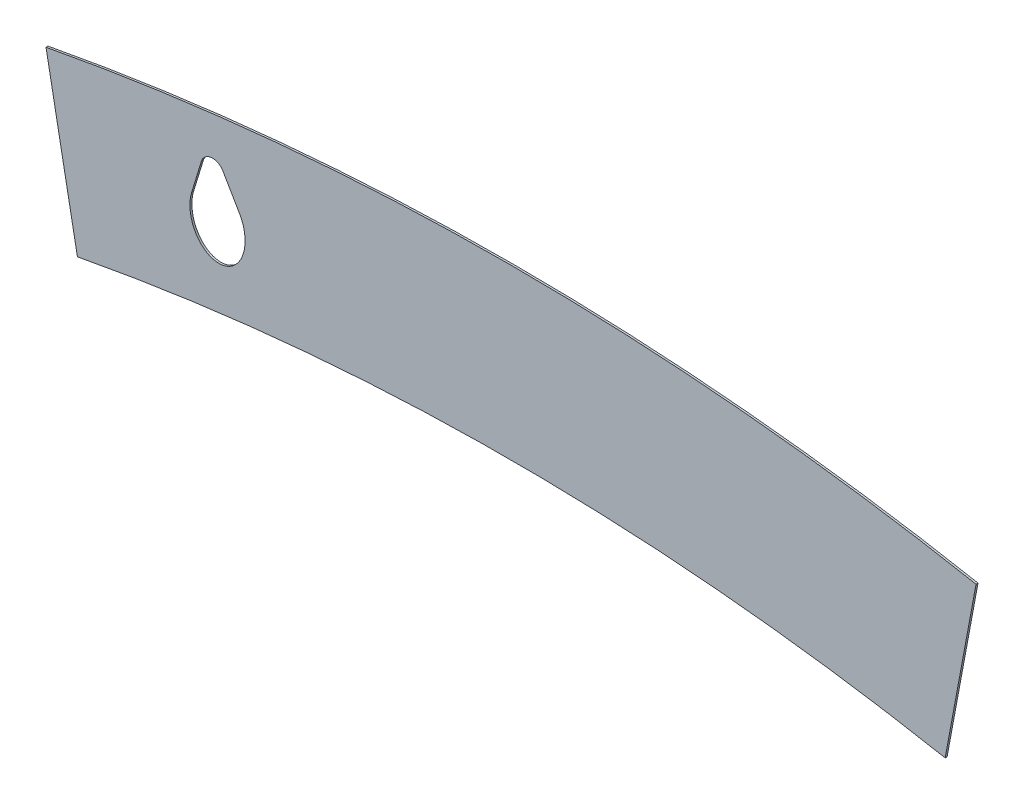
ISO-10303-21;
HEADER;
FILE_DESCRIPTION(('STEP AP214'),'2;1');
FILE_NAME('part.step','',(''),(''),'','','');
FILE_SCHEMA(('AUTOMOTIVE_DESIGN { 1 0 10303 214 1 1 1 1 }'));
ENDSEC;
DATA;
#1=APPLICATION_CONTEXT('core data for automotive mechanical design processes');
#2=APPLICATION_PROTOCOL_DEFINITION('international standard','automotive_design',2000,#1);
#3=PRODUCT_CONTEXT('',#1,'mechanical');
#4=PRODUCT('Part','Part','',(#3));
#5=PRODUCT_RELATED_PRODUCT_CATEGORY('part','',(#4));
#6=PRODUCT_DEFINITION_FORMATION('','',#4);
#7=PRODUCT_DEFINITION_CONTEXT('part definition',#1,'design');
#8=PRODUCT_DEFINITION('design','',#6,#7);
#9=PRODUCT_DEFINITION_SHAPE('','',#8);
#10=(LENGTH_UNIT() NAMED_UNIT(*) SI_UNIT(.MILLI.,.METRE.));
#11=(NAMED_UNIT(*) PLANE_ANGLE_UNIT() SI_UNIT($,.RADIAN.));
#12=(NAMED_UNIT(*) SI_UNIT($,.STERADIAN.) SOLID_ANGLE_UNIT());
#13=UNCERTAINTY_MEASURE_WITH_UNIT(LENGTH_MEASURE(1.E-05),#10,'distance_accuracy_value','');
#14=(GEOMETRIC_REPRESENTATION_CONTEXT(3) GLOBAL_UNCERTAINTY_ASSIGNED_CONTEXT((#13)) GLOBAL_UNIT_ASSIGNED_CONTEXT((#10,
#11,#12)) REPRESENTATION_CONTEXT('',''));
#15=CARTESIAN_POINT('',(0.,0.,0.));
#16=DIRECTION('',(0.,0.,1.));
#17=DIRECTION('',(1.,0.,0.));
#18=AXIS2_PLACEMENT_3D('',#15,#16,#17);
#19=CARTESIAN_POINT('',(1.23411425878377E-12,-4031.0562,-3.175));
#20=DIRECTION('',(0.,0.,1.));
#21=DIRECTION('',(1.,0.,0.));
#22=AXIS2_PLACEMENT_3D('',#19,#20,#21);
#23=CYLINDRICAL_SURFACE('',#22,4031.0562);
#24=CARTESIAN_POINT('',(1.23411425878377E-12,-4031.0562,0.));
#25=DIRECTION('',(0.,0.,1.));
#26=DIRECTION('',(1.,0.,0.));
#27=AXIS2_PLACEMENT_3D('',#24,#25,#26);
#28=CIRCLE('',#27,4031.0562);
#29=CARTESIAN_POINT('',(752.475,-70.8547579097826,0.));
#30=VERTEX_POINT('',#29);
#31=CARTESIAN_POINT('',(-752.475,-70.8547579097828,0.));
#32=VERTEX_POINT('',#31);
#33=EDGE_CURVE('E164',#30,#32,#28,.T.);
#34=ORIENTED_EDGE('',*,*,#33,.F.);
#35=DIRECTION('',(0.,0.,1.));
#36=VECTOR('',#35,1.);
#37=CARTESIAN_POINT('',(752.475,-70.8547579097826,-3.175));
#38=LINE('',#37,#36);
#39=CARTESIAN_POINT('',(752.475,-70.8547579097826,-3.175));
#40=VERTEX_POINT('',#39);
#41=EDGE_CURVE('E11',#40,#30,#38,.T.);
#42=ORIENTED_EDGE('',*,*,#41,.F.);
#43=CARTESIAN_POINT('',(1.23411425878377E-12,-4031.0562,-3.175));
#44=DIRECTION('',(0.,0.,1.));
#45=DIRECTION('',(1.,0.,0.));
#46=AXIS2_PLACEMENT_3D('',#43,#44,#45);
#47=CIRCLE('',#46,4031.0562);
#48=CARTESIAN_POINT('',(-752.475,-70.8547579097828,-3.175));
#49=VERTEX_POINT('',#48);
#50=EDGE_CURVE('E177',#40,#49,#47,.T.);
#51=ORIENTED_EDGE('',*,*,#50,.T.);
#52=DIRECTION('',(0.,0.,1.));
#53=VECTOR('',#52,1.);
#54=CARTESIAN_POINT('',(-752.475,-70.8547579097828,-3.175));
#55=LINE('',#54,#53);
#56=EDGE_CURVE('E35',#49,#32,#55,.T.);
#57=ORIENTED_EDGE('',*,*,#56,.T.);
#58=EDGE_LOOP('',(#34,#42,#51,#57));
#59=FACE_BOUND('',#58,.T.);
#60=ADVANCED_FACE('F32',(#59),#23,.T.);
#61=CARTESIAN_POINT('',(752.475,-70.8547579097826,-3.175));
#62=DIRECTION('',(0.983100169314669,-0.183068449202668,0.));
#63=DIRECTION('',(0.183068449202668,0.983100169314669,0.));
#64=AXIS2_PLACEMENT_3D('',#61,#62,#63);
#65=PLANE('',#64);
#66=DIRECTION('',(0.183068449202668,0.983100169314669,0.));
#67=VECTOR('',#66,1.);
#68=CARTESIAN_POINT('',(752.475,-70.8547579097826,0.));
#69=LINE('',#68,#67);
#70=CARTESIAN_POINT('',(702.4878,-339.292192091369,0.));
#71=VERTEX_POINT('',#70);
#72=EDGE_CURVE('E174',#71,#30,#69,.T.);
#73=ORIENTED_EDGE('',*,*,#72,.F.);
#74=DIRECTION('',(0.,0.,1.));
#75=VECTOR('',#74,1.);
#76=CARTESIAN_POINT('',(702.4878,-339.292192091369,-3.175));
#77=LINE('',#76,#75);
#78=CARTESIAN_POINT('',(702.4878,-339.292192091369,-3.175));
#79=VERTEX_POINT('',#78);
#80=EDGE_CURVE('E40',#79,#71,#77,.T.);
#81=ORIENTED_EDGE('',*,*,#80,.F.);
#82=DIRECTION('',(0.183068449202668,0.983100169314669,0.));
#83=VECTOR('',#82,1.);
#84=CARTESIAN_POINT('',(752.475,-70.8547579097826,-3.175));
#85=LINE('',#84,#83);
#86=EDGE_CURVE('E189',#79,#40,#85,.T.);
#87=ORIENTED_EDGE('',*,*,#86,.T.);
#88=ORIENTED_EDGE('',*,*,#41,.T.);
#89=EDGE_LOOP('',(#73,#81,#87,#88));
#90=FACE_BOUND('',#89,.T.);
#91=ADVANCED_FACE('F146',(#90),#65,.T.);
#92=CARTESIAN_POINT('',(1.23411425878377E-12,-4031.0562,-3.175));
#93=DIRECTION('',(0.,0.,1.));
#94=DIRECTION('',(1.,0.,0.));
#95=AXIS2_PLACEMENT_3D('',#92,#93,#94);
#96=CYLINDRICAL_SURFACE('',#95,3758.0062);
#97=CARTESIAN_POINT('',(1.23411425878377E-12,-4031.0562,0.));
#98=DIRECTION('',(0.,0.,-1.));
#99=DIRECTION('',(1.,0.,0.));
#100=AXIS2_PLACEMENT_3D('',#97,#98,#99);
#101=CIRCLE('',#100,3758.0062);
#102=CARTESIAN_POINT('',(-701.6242,-339.127966513765,0.));
#103=VERTEX_POINT('',#102);
#104=EDGE_CURVE('E176',#103,#71,#101,.T.);
#105=ORIENTED_EDGE('',*,*,#104,.F.);
#106=DIRECTION('',(0.,0.,1.));
#107=VECTOR('',#106,1.);
#108=CARTESIAN_POINT('',(-701.6242,-339.127966513765,-3.175));
#109=LINE('',#108,#107);
#110=CARTESIAN_POINT('',(-701.6242,-339.127966513765,-3.175));
#111=VERTEX_POINT('',#110);
#112=EDGE_CURVE('E192',#111,#103,#109,.T.);
#113=ORIENTED_EDGE('',*,*,#112,.F.);
#114=CARTESIAN_POINT('',(1.23411425878377E-12,-4031.0562,-3.175));
#115=DIRECTION('',(0.,0.,-1.));
#116=DIRECTION('',(1.,0.,0.));
#117=AXIS2_PLACEMENT_3D('',#114,#115,#116);
#118=CIRCLE('',#117,3758.0062);
#119=EDGE_CURVE('E186',#111,#79,#118,.T.);
#120=ORIENTED_EDGE('',*,*,#119,.T.);
#121=ORIENTED_EDGE('',*,*,#80,.T.);
#122=EDGE_LOOP('',(#105,#113,#120,#121));
#123=FACE_BOUND('',#122,.T.);
#124=ADVANCED_FACE('F149',(#123),#96,.F.);
#125=CARTESIAN_POINT('',(-752.475,-70.8547579097828,-3.175));
#126=DIRECTION('',(-0.982505695477573,-0.186232538387173,0.));
#127=DIRECTION('',(0.186232538387173,-0.982505695477573,0.));
#128=AXIS2_PLACEMENT_3D('',#125,#126,#127);
#129=PLANE('',#128);
#130=DIRECTION('',(0.186232538387173,-0.982505695477573,0.));
#131=VECTOR('',#130,1.);
#132=CARTESIAN_POINT('',(-752.475,-70.8547579097828,0.));
#133=LINE('',#132,#131);
#134=EDGE_CURVE('E169',#32,#103,#133,.T.);
#135=ORIENTED_EDGE('',*,*,#134,.F.);
#136=ORIENTED_EDGE('',*,*,#56,.F.);
#137=DIRECTION('',(0.186232538387173,-0.982505695477573,0.));
#138=VECTOR('',#137,1.);
#139=CARTESIAN_POINT('',(-752.475,-70.8547579097828,-3.175));
#140=LINE('',#139,#138);
#141=EDGE_CURVE('E179',#49,#111,#140,.T.);
#142=ORIENTED_EDGE('',*,*,#141,.T.);
#143=ORIENTED_EDGE('',*,*,#112,.T.);
#144=EDGE_LOOP('',(#135,#136,#142,#143));
#145=FACE_BOUND('',#144,.T.);
#146=ADVANCED_FACE('F144',(#145),#129,.T.);
#147=CARTESIAN_POINT('',(1.23411425878377E-12,-4031.0562,-3.175));
#148=DIRECTION('',(0.,0.,1.));
#149=DIRECTION('',(1.,0.,0.));
#150=AXIS2_PLACEMENT_3D('',#147,#148,#149);
#151=PLANE('',#150);
#152=DIRECTION('',(-0.503529229828644,0.863978191106797,0.));
#153=VECTOR('',#152,1.);
#154=CARTESIAN_POINT('',(-466.360616412637,-100.986628704803,-3.175));
#155=LINE('',#154,#153);
#156=CARTESIAN_POINT('',(-439.299341759684,-147.419585797799,-3.175));
#157=VERTEX_POINT('',#156);
#158=CARTESIAN_POINT('',(-466.360616412637,-100.986628704803,-3.175));
#159=VERTEX_POINT('',#158);
#160=EDGE_CURVE('E127',#157,#159,#155,.T.);
#161=ORIENTED_EDGE('',*,*,#160,.T.);
#162=CARTESIAN_POINT('',(-482.819400953221,-110.578860533039,-3.175));
#163=DIRECTION('',(0.,0.,1.));
#164=DIRECTION('',(1.,0.,0.));
#165=AXIS2_PLACEMENT_3D('',#162,#163,#164);
#166=CIRCLE('',#165,19.05);
#167=CARTESIAN_POINT('',(-501.03372083315,-104.998443764406,-3.175));
#168=VERTEX_POINT('',#167);
#169=EDGE_CURVE('E117',#159,#168,#166,.T.);
#170=ORIENTED_EDGE('',*,*,#169,.T.);
#171=DIRECTION('',(-0.292935263445274,-0.956132277161611,0.));
#172=VECTOR('',#171,1.);
#173=CARTESIAN_POINT('',(-501.03372083315,-104.998443764406,-3.175));
#174=LINE('',#173,#172);
#175=CARTESIAN_POINT('',(-516.777000766125,-156.384056801467,-3.175));
#176=VERTEX_POINT('',#175);
#177=EDGE_CURVE('E123',#168,#176,#174,.T.);
#178=ORIENTED_EDGE('',*,*,#177,.T.);
#179=CARTESIAN_POINT('',(-474.973503717702,-178.388968944836,-3.175));
#180=DIRECTION('',(0.,0.,1.));
#181=DIRECTION('',(-0.114937150492866,0.993372765600397,0.));
#182=AXIS2_PLACEMENT_3D('',#179,#180,#181);
#183=ELLIPSE('',#182,55.5625,44.45);
#184=EDGE_CURVE('E48',#176,#157,#183,.T.);
#185=ORIENTED_EDGE('',*,*,#184,.T.);
#186=EDGE_LOOP('',(#161,#170,#178,#185));
#187=FACE_BOUND('',#186,.T.);
#188=ORIENTED_EDGE('',*,*,#50,.F.);
#189=ORIENTED_EDGE('',*,*,#86,.F.);
#190=ORIENTED_EDGE('',*,*,#119,.F.);
#191=ORIENTED_EDGE('',*,*,#141,.F.);
#192=EDGE_LOOP('',(#188,#189,#190,#191));
#193=FACE_BOUND('',#192,.T.);
#194=ADVANCED_FACE('F141',(#187,#193),#151,.F.);
#195=CARTESIAN_POINT('',(1.23411425878377E-12,-4031.0562,0.));
#196=DIRECTION('',(0.,0.,1.));
#197=DIRECTION('',(1.,0.,0.));
#198=AXIS2_PLACEMENT_3D('',#195,#196,#197);
#199=PLANE('',#198);
#200=CARTESIAN_POINT('',(-482.819400953221,-110.578860533039,0.));
#201=DIRECTION('',(0.,0.,1.));
#202=DIRECTION('',(1.,0.,0.));
#203=AXIS2_PLACEMENT_3D('',#200,#201,#202);
#204=CIRCLE('',#203,19.05);
#205=CARTESIAN_POINT('',(-466.360616412637,-100.986628704803,0.));
#206=VERTEX_POINT('',#205);
#207=CARTESIAN_POINT('',(-501.03372083315,-104.998443764406,0.));
#208=VERTEX_POINT('',#207);
#209=EDGE_CURVE('E56',#206,#208,#204,.T.);
#210=ORIENTED_EDGE('',*,*,#209,.F.);
#211=DIRECTION('',(-0.503529229828644,0.863978191106797,0.));
#212=VECTOR('',#211,1.);
#213=CARTESIAN_POINT('',(-466.360616412637,-100.986628704803,0.));
#214=LINE('',#213,#212);
#215=CARTESIAN_POINT('',(-439.299341759684,-147.419585797799,0.));
#216=VERTEX_POINT('',#215);
#217=EDGE_CURVE('E115',#216,#206,#214,.T.);
#218=ORIENTED_EDGE('',*,*,#217,.F.);
#219=CARTESIAN_POINT('',(-474.973503717702,-178.388968944836,0.));
#220=DIRECTION('',(0.,0.,1.));
#221=DIRECTION('',(-0.114937150492866,0.993372765600397,0.));
#222=AXIS2_PLACEMENT_3D('',#219,#220,#221);
#223=ELLIPSE('',#222,55.5625,44.45);
#224=CARTESIAN_POINT('',(-516.777000766125,-156.384056801467,0.));
#225=VERTEX_POINT('',#224);
#226=EDGE_CURVE('E99',#225,#216,#223,.T.);
#227=ORIENTED_EDGE('',*,*,#226,.F.);
#228=DIRECTION('',(-0.292935263445274,-0.956132277161611,0.));
#229=VECTOR('',#228,1.);
#230=CARTESIAN_POINT('',(-501.03372083315,-104.998443764406,0.));
#231=LINE('',#230,#229);
#232=EDGE_CURVE('E108',#208,#225,#231,.T.);
#233=ORIENTED_EDGE('',*,*,#232,.F.);
#234=EDGE_LOOP('',(#210,#218,#227,#233));
#235=FACE_BOUND('',#234,.T.);
#236=ORIENTED_EDGE('',*,*,#33,.T.);
#237=ORIENTED_EDGE('',*,*,#134,.T.);
#238=ORIENTED_EDGE('',*,*,#104,.T.);
#239=ORIENTED_EDGE('',*,*,#72,.T.);
#240=EDGE_LOOP('',(#236,#237,#238,#239));
#241=FACE_BOUND('',#240,.T.);
#242=ADVANCED_FACE('F112',(#235,#241),#199,.T.);
#243=CARTESIAN_POINT('',(-482.819400953221,-110.578860533039,-3.175));
#244=DIRECTION('',(0.,0.,1.));
#245=DIRECTION('',(1.,0.,0.));
#246=AXIS2_PLACEMENT_3D('',#243,#244,#245);
#247=CYLINDRICAL_SURFACE('',#246,19.05);
#248=ORIENTED_EDGE('',*,*,#209,.T.);
#249=DIRECTION('',(0.,0.,1.));
#250=VECTOR('',#249,1.);
#251=CARTESIAN_POINT('',(-501.03372083315,-104.998443764406,-3.175));
#252=LINE('',#251,#250);
#253=EDGE_CURVE('E105',#168,#208,#252,.T.);
#254=ORIENTED_EDGE('',*,*,#253,.F.);
#255=ORIENTED_EDGE('',*,*,#169,.F.);
#256=DIRECTION('',(0.,0.,1.));
#257=VECTOR('',#256,1.);
#258=CARTESIAN_POINT('',(-466.360616412637,-100.986628704803,-3.175));
#259=LINE('',#258,#257);
#260=EDGE_CURVE('E170',#159,#206,#259,.T.);
#261=ORIENTED_EDGE('',*,*,#260,.T.);
#262=EDGE_LOOP('',(#248,#254,#255,#261));
#263=FACE_BOUND('',#262,.T.);
#264=ADVANCED_FACE('F136',(#263),#247,.F.);
#265=CARTESIAN_POINT('',(-466.360616412637,-100.986628704803,-3.175));
#266=DIRECTION('',(0.863978191106797,0.503529229828644,0.));
#267=DIRECTION('',(-0.503529229828644,0.863978191106797,0.));
#268=AXIS2_PLACEMENT_3D('',#265,#266,#267);
#269=PLANE('',#268);
#270=ORIENTED_EDGE('',*,*,#217,.T.);
#271=ORIENTED_EDGE('',*,*,#260,.F.);
#272=ORIENTED_EDGE('',*,*,#160,.F.);
#273=DIRECTION('',(0.,0.,1.));
#274=VECTOR('',#273,1.);
#275=CARTESIAN_POINT('',(-439.299341759684,-147.419585797799,-3.175));
#276=LINE('',#275,#274);
#277=EDGE_CURVE('E104',#157,#216,#276,.T.);
#278=ORIENTED_EDGE('',*,*,#277,.T.);
#279=EDGE_LOOP('',(#270,#271,#272,#278));
#280=FACE_BOUND('',#279,.T.);
#281=ADVANCED_FACE('F133',(#280),#269,.F.);
#282=DIRECTION('',(0.,0.,1.));
#283=VECTOR('',#282,1.);
#284=SURFACE_OF_LINEAR_EXTRUSION('',#183,#283);
#285=ORIENTED_EDGE('',*,*,#226,.T.);
#286=ORIENTED_EDGE('',*,*,#277,.F.);
#287=ORIENTED_EDGE('',*,*,#184,.F.);
#288=DIRECTION('',(0.,0.,1.));
#289=VECTOR('',#288,1.);
#290=CARTESIAN_POINT('',(-516.777000766125,-156.384056801467,-3.175));
#291=LINE('',#290,#289);
#292=EDGE_CURVE('E95',#176,#225,#291,.T.);
#293=ORIENTED_EDGE('',*,*,#292,.T.);
#294=EDGE_LOOP('',(#285,#286,#287,#293));
#295=FACE_BOUND('',#294,.T.);
#296=ADVANCED_FACE('F97',(#295),#284,.F.);
#297=CARTESIAN_POINT('',(-501.03372083315,-104.998443764406,-3.175));
#298=DIRECTION('',(-0.956132277161611,0.292935263445274,0.));
#299=DIRECTION('',(-0.292935263445274,-0.956132277161611,0.));
#300=AXIS2_PLACEMENT_3D('',#297,#298,#299);
#301=PLANE('',#300);
#302=ORIENTED_EDGE('',*,*,#232,.T.);
#303=ORIENTED_EDGE('',*,*,#292,.F.);
#304=ORIENTED_EDGE('',*,*,#177,.F.);
#305=ORIENTED_EDGE('',*,*,#253,.T.);
#306=EDGE_LOOP('',(#302,#303,#304,#305));
#307=FACE_BOUND('',#306,.T.);
#308=ADVANCED_FACE('F109',(#307),#301,.F.);
#309=CLOSED_SHELL('',(#60,#91,#124,#146,#194,#242,#264,#281,#296,#308));
#310=MANIFOLD_SOLID_BREP('B2',#309);
#311=ADVANCED_BREP_SHAPE_REPRESENTATION('',(#18,#310),#14);
#312=SHAPE_DEFINITION_REPRESENTATION(#9,#311);
ENDSEC;
END-ISO-10303-21;
